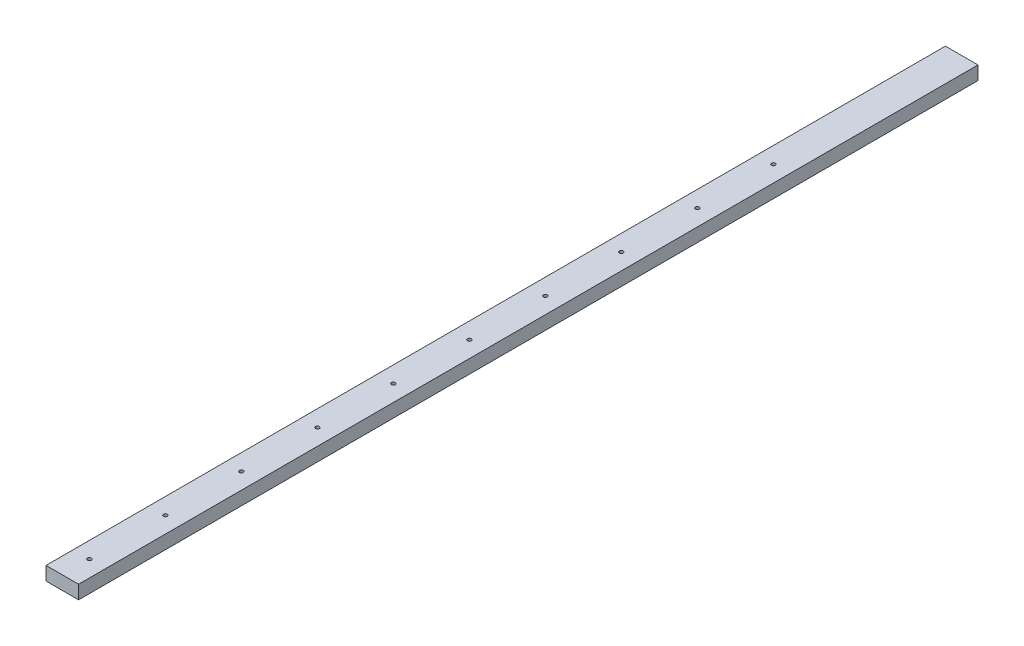
ISO-10303-21;
HEADER;
FILE_DESCRIPTION(('STEP AP214'),'2;1');
FILE_NAME('part.step','',(''),(''),'','','');
FILE_SCHEMA(('AUTOMOTIVE_DESIGN { 1 0 10303 214 1 1 1 1 }'));
ENDSEC;
DATA;
#1=APPLICATION_CONTEXT('core data for automotive mechanical design processes');
#2=APPLICATION_PROTOCOL_DEFINITION('international standard','automotive_design',2000,#1);
#3=PRODUCT_CONTEXT('',#1,'mechanical');
#4=PRODUCT('Part','Part','',(#3));
#5=PRODUCT_RELATED_PRODUCT_CATEGORY('part','',(#4));
#6=PRODUCT_DEFINITION_FORMATION('','',#4);
#7=PRODUCT_DEFINITION_CONTEXT('part definition',#1,'design');
#8=PRODUCT_DEFINITION('design','',#6,#7);
#9=PRODUCT_DEFINITION_SHAPE('','',#8);
#10=(LENGTH_UNIT() NAMED_UNIT(*) SI_UNIT(.MILLI.,.METRE.));
#11=(NAMED_UNIT(*) PLANE_ANGLE_UNIT() SI_UNIT($,.RADIAN.));
#12=(NAMED_UNIT(*) SI_UNIT($,.STERADIAN.) SOLID_ANGLE_UNIT());
#13=UNCERTAINTY_MEASURE_WITH_UNIT(LENGTH_MEASURE(1.E-05),#10,'distance_accuracy_value','');
#14=(GEOMETRIC_REPRESENTATION_CONTEXT(3) GLOBAL_UNCERTAINTY_ASSIGNED_CONTEXT((#13)) GLOBAL_UNIT_ASSIGNED_CONTEXT((#10,
#11,#12)) REPRESENTATION_CONTEXT('',''));
#15=CARTESIAN_POINT('',(0.,0.,0.));
#16=DIRECTION('',(0.,0.,1.));
#17=DIRECTION('',(1.,0.,0.));
#18=AXIS2_PLACEMENT_3D('',#15,#16,#17);
#19=CARTESIAN_POINT('',(30.,-12.5,1657.));
#20=DIRECTION('',(-1.,0.,0.));
#21=DIRECTION('',(0.,0.,1.));
#22=AXIS2_PLACEMENT_3D('',#19,#20,#21);
#23=PLANE('',#22);
#24=DIRECTION('',(0.,1.,0.));
#25=VECTOR('',#24,1.);
#26=CARTESIAN_POINT('',(30.,-12.5,0.));
#27=LINE('',#26,#25);
#28=CARTESIAN_POINT('',(30.,-12.5,0.));
#29=VERTEX_POINT('',#28);
#30=CARTESIAN_POINT('',(30.,12.5,0.));
#31=VERTEX_POINT('',#30);
#32=EDGE_CURVE('E106',#29,#31,#27,.T.);
#33=ORIENTED_EDGE('',*,*,#32,.T.);
#34=DIRECTION('',(0.,0.,-1.));
#35=VECTOR('',#34,1.);
#36=CARTESIAN_POINT('',(30.,12.5,1657.));
#37=LINE('',#36,#35);
#38=CARTESIAN_POINT('',(30.,12.5,1657.));
#39=VERTEX_POINT('',#38);
#40=EDGE_CURVE('E11',#39,#31,#37,.T.);
#41=ORIENTED_EDGE('',*,*,#40,.F.);
#42=DIRECTION('',(0.,1.,0.));
#43=VECTOR('',#42,1.);
#44=CARTESIAN_POINT('',(30.,-12.5,1657.));
#45=LINE('',#44,#43);
#46=CARTESIAN_POINT('',(30.,-12.5,1657.));
#47=VERTEX_POINT('',#46);
#48=EDGE_CURVE('E94',#47,#39,#45,.T.);
#49=ORIENTED_EDGE('',*,*,#48,.F.);
#50=DIRECTION('',(0.,0.,-1.));
#51=VECTOR('',#50,1.);
#52=CARTESIAN_POINT('',(30.,-12.5,1657.));
#53=LINE('',#52,#51);
#54=EDGE_CURVE('E102',#47,#29,#53,.T.);
#55=ORIENTED_EDGE('',*,*,#54,.T.);
#56=EDGE_LOOP('',(#33,#41,#49,#55));
#57=FACE_BOUND('',#56,.T.);
#58=ADVANCED_FACE('F43',(#57),#23,.F.);
#59=CARTESIAN_POINT('',(-30.,12.5,1657.));
#60=DIRECTION('',(0.,-1.,0.));
#61=DIRECTION('',(0.,0.,-1.));
#62=AXIS2_PLACEMENT_3D('',#59,#60,#61);
#63=PLANE('',#62);
#64=CARTESIAN_POINT('',(1.9680074062298E-13,12.5,1607.));
#65=DIRECTION('',(0.,-1.,0.));
#66=DIRECTION('',(0.,0.,-1.));
#67=AXIS2_PLACEMENT_3D('',#64,#65,#66);
#68=CIRCLE('',#67,3.49999999999991);
#69=CARTESIAN_POINT('',(1.9680074062298E-13,12.5,1603.5));
#70=VERTEX_POINT('',#69);
#71=EDGE_CURVE('E123',#70,#70,#68,.T.);
#72=ORIENTED_EDGE('',*,*,#71,.T.);
#73=EDGE_LOOP('',(#72));
#74=FACE_BOUND('',#73,.T.);
#75=CARTESIAN_POINT('',(-2.83434119221028E-13,12.5,1467.));
#76=DIRECTION('',(0.,-1.,0.));
#77=DIRECTION('',(0.,0.,-1.));
#78=AXIS2_PLACEMENT_3D('',#75,#76,#77);
#79=CIRCLE('',#78,3.49999999999989);
#80=CARTESIAN_POINT('',(-2.83434119221028E-13,12.5,1463.5));
#81=VERTEX_POINT('',#80);
#82=EDGE_CURVE('E128',#81,#81,#79,.T.);
#83=ORIENTED_EDGE('',*,*,#82,.T.);
#84=EDGE_LOOP('',(#83));
#85=FACE_BOUND('',#84,.T.);
#86=CARTESIAN_POINT('',(-7.63668979065035E-13,12.5,1327.));
#87=DIRECTION('',(0.,-1.,0.));
#88=DIRECTION('',(0.,0.,-1.));
#89=AXIS2_PLACEMENT_3D('',#86,#87,#88);
#90=CIRCLE('',#89,3.49999999999989);
#91=CARTESIAN_POINT('',(-7.63668979065035E-13,12.5,1323.5));
#92=VERTEX_POINT('',#91);
#93=EDGE_CURVE('E131',#92,#92,#90,.T.);
#94=ORIENTED_EDGE('',*,*,#93,.T.);
#95=EDGE_LOOP('',(#94));
#96=FACE_BOUND('',#95,.T.);
#97=CARTESIAN_POINT('',(-1.24390383890904E-12,12.5,1187.));
#98=DIRECTION('',(0.,-1.,0.));
#99=DIRECTION('',(0.,0.,-1.));
#100=AXIS2_PLACEMENT_3D('',#97,#98,#99);
#101=CIRCLE('',#100,3.49999999999995);
#102=CARTESIAN_POINT('',(-1.24390383890904E-12,12.5,1183.5));
#103=VERTEX_POINT('',#102);
#104=EDGE_CURVE('E134',#103,#103,#101,.T.);
#105=ORIENTED_EDGE('',*,*,#104,.T.);
#106=EDGE_LOOP('',(#105));
#107=FACE_BOUND('',#106,.T.);
#108=CARTESIAN_POINT('',(-1.72413869875305E-12,12.5,1047.));
#109=DIRECTION('',(0.,-1.,0.));
#110=DIRECTION('',(0.,0.,-1.));
#111=AXIS2_PLACEMENT_3D('',#108,#109,#110);
#112=CIRCLE('',#111,3.49999999999995);
#113=CARTESIAN_POINT('',(-1.72413869875305E-12,12.5,1043.5));
#114=VERTEX_POINT('',#113);
#115=EDGE_CURVE('E137',#114,#114,#112,.T.);
#116=ORIENTED_EDGE('',*,*,#115,.T.);
#117=EDGE_LOOP('',(#116));
#118=FACE_BOUND('',#117,.T.);
#119=CARTESIAN_POINT('',(-2.20437355859706E-12,12.5,907.));
#120=DIRECTION('',(0.,-1.,0.));
#121=DIRECTION('',(0.,0.,-1.));
#122=AXIS2_PLACEMENT_3D('',#119,#120,#121);
#123=CIRCLE('',#122,3.49999999999998);
#124=CARTESIAN_POINT('',(-2.20437355859706E-12,12.5,903.5));
#125=VERTEX_POINT('',#124);
#126=EDGE_CURVE('E140',#125,#125,#123,.T.);
#127=ORIENTED_EDGE('',*,*,#126,.T.);
#128=EDGE_LOOP('',(#127));
#129=FACE_BOUND('',#128,.T.);
#130=CARTESIAN_POINT('',(-2.68460841844106E-12,12.5,767.));
#131=DIRECTION('',(0.,-1.,0.));
#132=DIRECTION('',(0.,0.,-1.));
#133=AXIS2_PLACEMENT_3D('',#130,#131,#132);
#134=CIRCLE('',#133,3.49999999999998);
#135=CARTESIAN_POINT('',(-2.68460841844106E-12,12.5,763.5));
#136=VERTEX_POINT('',#135);
#137=EDGE_CURVE('E143',#136,#136,#134,.T.);
#138=ORIENTED_EDGE('',*,*,#137,.T.);
#139=EDGE_LOOP('',(#138));
#140=FACE_BOUND('',#139,.T.);
#141=CARTESIAN_POINT('',(-3.16484327828507E-12,12.5,627.));
#142=DIRECTION('',(0.,-1.,0.));
#143=DIRECTION('',(0.,0.,-1.));
#144=AXIS2_PLACEMENT_3D('',#141,#142,#143);
#145=CIRCLE('',#144,3.49999999999995);
#146=CARTESIAN_POINT('',(-3.16484327828507E-12,12.5,623.5));
#147=VERTEX_POINT('',#146);
#148=EDGE_CURVE('E146',#147,#147,#145,.T.);
#149=ORIENTED_EDGE('',*,*,#148,.T.);
#150=EDGE_LOOP('',(#149));
#151=FACE_BOUND('',#150,.T.);
#152=CARTESIAN_POINT('',(-3.64507813812908E-12,12.5,487.));
#153=DIRECTION('',(0.,-1.,0.));
#154=DIRECTION('',(0.,0.,-1.));
#155=AXIS2_PLACEMENT_3D('',#152,#153,#154);
#156=CIRCLE('',#155,3.49999999999995);
#157=CARTESIAN_POINT('',(-3.64507813812908E-12,12.5,483.5));
#158=VERTEX_POINT('',#157);
#159=EDGE_CURVE('E149',#158,#158,#156,.T.);
#160=ORIENTED_EDGE('',*,*,#159,.T.);
#161=EDGE_LOOP('',(#160));
#162=FACE_BOUND('',#161,.T.);
#163=CARTESIAN_POINT('',(-4.12531299797309E-12,12.5,347.));
#164=DIRECTION('',(0.,-1.,0.));
#165=DIRECTION('',(0.,0.,-1.));
#166=AXIS2_PLACEMENT_3D('',#163,#164,#165);
#167=CIRCLE('',#166,3.49999999999995);
#168=CARTESIAN_POINT('',(-4.12531299797309E-12,12.5,343.5));
#169=VERTEX_POINT('',#168);
#170=EDGE_CURVE('E152',#169,#169,#167,.T.);
#171=ORIENTED_EDGE('',*,*,#170,.T.);
#172=EDGE_LOOP('',(#171));
#173=FACE_BOUND('',#172,.T.);
#174=DIRECTION('',(-1.,0.,0.));
#175=VECTOR('',#174,1.);
#176=CARTESIAN_POINT('',(-30.,12.5,0.));
#177=LINE('',#176,#175);
#178=CARTESIAN_POINT('',(-30.,12.5,0.));
#179=VERTEX_POINT('',#178);
#180=EDGE_CURVE('E98',#31,#179,#177,.T.);
#181=ORIENTED_EDGE('',*,*,#180,.T.);
#182=DIRECTION('',(0.,0.,-1.));
#183=VECTOR('',#182,1.);
#184=CARTESIAN_POINT('',(-30.,12.5,1657.));
#185=LINE('',#184,#183);
#186=CARTESIAN_POINT('',(-30.,12.5,1657.));
#187=VERTEX_POINT('',#186);
#188=EDGE_CURVE('E51',#187,#179,#185,.T.);
#189=ORIENTED_EDGE('',*,*,#188,.F.);
#190=DIRECTION('',(-1.,0.,0.));
#191=VECTOR('',#190,1.);
#192=CARTESIAN_POINT('',(-30.,12.5,1657.));
#193=LINE('',#192,#191);
#194=EDGE_CURVE('E89',#39,#187,#193,.T.);
#195=ORIENTED_EDGE('',*,*,#194,.F.);
#196=ORIENTED_EDGE('',*,*,#40,.T.);
#197=EDGE_LOOP('',(#181,#189,#195,#196));
#198=FACE_BOUND('',#197,.T.);
#199=ADVANCED_FACE('F97',(#74,#85,#96,#107,#118,#129,#140,#151,#162,#173,#198),#63,.F.);
#200=CARTESIAN_POINT('',(-30.,-12.5,1657.));
#201=DIRECTION('',(1.,0.,0.));
#202=DIRECTION('',(0.,0.,-1.));
#203=AXIS2_PLACEMENT_3D('',#200,#201,#202);
#204=PLANE('',#203);
#205=DIRECTION('',(0.,-1.,0.));
#206=VECTOR('',#205,1.);
#207=CARTESIAN_POINT('',(-30.,-12.5,0.));
#208=LINE('',#207,#206);
#209=CARTESIAN_POINT('',(-30.,-12.5,0.));
#210=VERTEX_POINT('',#209);
#211=EDGE_CURVE('E76',#179,#210,#208,.T.);
#212=ORIENTED_EDGE('',*,*,#211,.T.);
#213=DIRECTION('',(0.,0.,-1.));
#214=VECTOR('',#213,1.);
#215=CARTESIAN_POINT('',(-30.,-12.5,1657.));
#216=LINE('',#215,#214);
#217=CARTESIAN_POINT('',(-30.,-12.5,1657.));
#218=VERTEX_POINT('',#217);
#219=EDGE_CURVE('E99',#218,#210,#216,.T.);
#220=ORIENTED_EDGE('',*,*,#219,.F.);
#221=DIRECTION('',(0.,-1.,0.));
#222=VECTOR('',#221,1.);
#223=CARTESIAN_POINT('',(-30.,-12.5,1657.));
#224=LINE('',#223,#222);
#225=EDGE_CURVE('E92',#187,#218,#224,.T.);
#226=ORIENTED_EDGE('',*,*,#225,.F.);
#227=ORIENTED_EDGE('',*,*,#188,.T.);
#228=EDGE_LOOP('',(#212,#220,#226,#227));
#229=FACE_BOUND('',#228,.T.);
#230=ADVANCED_FACE('F100',(#229),#204,.F.);
#231=CARTESIAN_POINT('',(-30.,-12.5,1657.));
#232=DIRECTION('',(0.,1.,0.));
#233=DIRECTION('',(0.,0.,1.));
#234=AXIS2_PLACEMENT_3D('',#231,#232,#233);
#235=PLANE('',#234);
#236=CARTESIAN_POINT('',(1.9680074062298E-13,-12.5,1607.));
#237=DIRECTION('',(0.,1.,0.));
#238=DIRECTION('',(0.,0.,1.));
#239=AXIS2_PLACEMENT_3D('',#236,#237,#238);
#240=CIRCLE('',#239,3.49999999999991);
#241=CARTESIAN_POINT('',(1.9680074062298E-13,-12.5,1610.5));
#242=VERTEX_POINT('',#241);
#243=EDGE_CURVE('E155',#242,#242,#240,.T.);
#244=ORIENTED_EDGE('',*,*,#243,.T.);
#245=EDGE_LOOP('',(#244));
#246=FACE_BOUND('',#245,.T.);
#247=CARTESIAN_POINT('',(-2.83434119221028E-13,-12.5,1467.));
#248=DIRECTION('',(0.,1.,0.));
#249=DIRECTION('',(0.,0.,1.));
#250=AXIS2_PLACEMENT_3D('',#247,#248,#249);
#251=CIRCLE('',#250,3.49999999999989);
#252=CARTESIAN_POINT('',(-2.83434119221028E-13,-12.5,1470.5));
#253=VERTEX_POINT('',#252);
#254=EDGE_CURVE('E180',#253,#253,#251,.T.);
#255=ORIENTED_EDGE('',*,*,#254,.T.);
#256=EDGE_LOOP('',(#255));
#257=FACE_BOUND('',#256,.T.);
#258=CARTESIAN_POINT('',(-7.63668979065035E-13,-12.5,1327.));
#259=DIRECTION('',(0.,1.,0.));
#260=DIRECTION('',(0.,0.,1.));
#261=AXIS2_PLACEMENT_3D('',#258,#259,#260);
#262=CIRCLE('',#261,3.49999999999989);
#263=CARTESIAN_POINT('',(-7.63668979065035E-13,-12.5,1330.5));
#264=VERTEX_POINT('',#263);
#265=EDGE_CURVE('E177',#264,#264,#262,.T.);
#266=ORIENTED_EDGE('',*,*,#265,.T.);
#267=EDGE_LOOP('',(#266));
#268=FACE_BOUND('',#267,.T.);
#269=CARTESIAN_POINT('',(-1.24390383890904E-12,-12.5,1187.));
#270=DIRECTION('',(0.,1.,0.));
#271=DIRECTION('',(0.,0.,1.));
#272=AXIS2_PLACEMENT_3D('',#269,#270,#271);
#273=CIRCLE('',#272,3.49999999999995);
#274=CARTESIAN_POINT('',(-1.24390383890904E-12,-12.5,1190.5));
#275=VERTEX_POINT('',#274);
#276=EDGE_CURVE('E174',#275,#275,#273,.T.);
#277=ORIENTED_EDGE('',*,*,#276,.T.);
#278=EDGE_LOOP('',(#277));
#279=FACE_BOUND('',#278,.T.);
#280=CARTESIAN_POINT('',(-1.72413869875305E-12,-12.5,1047.));
#281=DIRECTION('',(0.,1.,0.));
#282=DIRECTION('',(0.,0.,1.));
#283=AXIS2_PLACEMENT_3D('',#280,#281,#282);
#284=CIRCLE('',#283,3.49999999999995);
#285=CARTESIAN_POINT('',(-1.72413869875305E-12,-12.5,1050.5));
#286=VERTEX_POINT('',#285);
#287=EDGE_CURVE('E171',#286,#286,#284,.T.);
#288=ORIENTED_EDGE('',*,*,#287,.T.);
#289=EDGE_LOOP('',(#288));
#290=FACE_BOUND('',#289,.T.);
#291=CARTESIAN_POINT('',(-2.20437355859706E-12,-12.5,907.));
#292=DIRECTION('',(0.,1.,0.));
#293=DIRECTION('',(0.,0.,1.));
#294=AXIS2_PLACEMENT_3D('',#291,#292,#293);
#295=CIRCLE('',#294,3.49999999999998);
#296=CARTESIAN_POINT('',(-2.20437355859706E-12,-12.5,910.5));
#297=VERTEX_POINT('',#296);
#298=EDGE_CURVE('E168',#297,#297,#295,.T.);
#299=ORIENTED_EDGE('',*,*,#298,.T.);
#300=EDGE_LOOP('',(#299));
#301=FACE_BOUND('',#300,.T.);
#302=CARTESIAN_POINT('',(-2.68460841844106E-12,-12.5,767.));
#303=DIRECTION('',(0.,1.,0.));
#304=DIRECTION('',(0.,0.,1.));
#305=AXIS2_PLACEMENT_3D('',#302,#303,#304);
#306=CIRCLE('',#305,3.49999999999998);
#307=CARTESIAN_POINT('',(-2.68460841844106E-12,-12.5,770.5));
#308=VERTEX_POINT('',#307);
#309=EDGE_CURVE('E165',#308,#308,#306,.T.);
#310=ORIENTED_EDGE('',*,*,#309,.T.);
#311=EDGE_LOOP('',(#310));
#312=FACE_BOUND('',#311,.T.);
#313=CARTESIAN_POINT('',(-3.16484327828507E-12,-12.5,627.));
#314=DIRECTION('',(0.,1.,0.));
#315=DIRECTION('',(0.,0.,1.));
#316=AXIS2_PLACEMENT_3D('',#313,#314,#315);
#317=CIRCLE('',#316,3.49999999999995);
#318=CARTESIAN_POINT('',(-3.16484327828507E-12,-12.5,630.5));
#319=VERTEX_POINT('',#318);
#320=EDGE_CURVE('E162',#319,#319,#317,.T.);
#321=ORIENTED_EDGE('',*,*,#320,.T.);
#322=EDGE_LOOP('',(#321));
#323=FACE_BOUND('',#322,.T.);
#324=CARTESIAN_POINT('',(-3.64507813812908E-12,-12.5,487.));
#325=DIRECTION('',(0.,1.,0.));
#326=DIRECTION('',(0.,0.,1.));
#327=AXIS2_PLACEMENT_3D('',#324,#325,#326);
#328=CIRCLE('',#327,3.49999999999995);
#329=CARTESIAN_POINT('',(-3.64507813812908E-12,-12.5,490.5));
#330=VERTEX_POINT('',#329);
#331=EDGE_CURVE('E159',#330,#330,#328,.T.);
#332=ORIENTED_EDGE('',*,*,#331,.T.);
#333=EDGE_LOOP('',(#332));
#334=FACE_BOUND('',#333,.T.);
#335=CARTESIAN_POINT('',(-4.12531299797309E-12,-12.5,347.));
#336=DIRECTION('',(0.,1.,0.));
#337=DIRECTION('',(0.,0.,1.));
#338=AXIS2_PLACEMENT_3D('',#335,#336,#337);
#339=CIRCLE('',#338,3.49999999999995);
#340=CARTESIAN_POINT('',(-4.12531299797309E-12,-12.5,350.5));
#341=VERTEX_POINT('',#340);
#342=EDGE_CURVE('E156',#341,#341,#339,.T.);
#343=ORIENTED_EDGE('',*,*,#342,.T.);
#344=EDGE_LOOP('',(#343));
#345=FACE_BOUND('',#344,.T.);
#346=CARTESIAN_POINT('',(-5.,-12.5,72.));
#347=DIRECTION('',(0.,-1.,0.));
#348=DIRECTION('',(0.,0.,-1.));
#349=AXIS2_PLACEMENT_3D('',#346,#347,#348);
#350=CIRCLE('',#349,15.);
#351=CARTESIAN_POINT('',(-5.,-12.5,57.));
#352=VERTEX_POINT('',#351);
#353=EDGE_CURVE('E120',#352,#352,#350,.T.);
#354=ORIENTED_EDGE('',*,*,#353,.F.);
#355=EDGE_LOOP('',(#354));
#356=FACE_BOUND('',#355,.T.);
#357=DIRECTION('',(1.,0.,0.));
#358=VECTOR('',#357,1.);
#359=CARTESIAN_POINT('',(-30.,-12.5,0.));
#360=LINE('',#359,#358);
#361=EDGE_CURVE('E82',#210,#29,#360,.T.);
#362=ORIENTED_EDGE('',*,*,#361,.T.);
#363=ORIENTED_EDGE('',*,*,#54,.F.);
#364=DIRECTION('',(1.,0.,0.));
#365=VECTOR('',#364,1.);
#366=CARTESIAN_POINT('',(-30.,-12.5,1657.));
#367=LINE('',#366,#365);
#368=EDGE_CURVE('E59',#218,#47,#367,.T.);
#369=ORIENTED_EDGE('',*,*,#368,.F.);
#370=ORIENTED_EDGE('',*,*,#219,.T.);
#371=EDGE_LOOP('',(#362,#363,#369,#370));
#372=FACE_BOUND('',#371,.T.);
#373=ADVANCED_FACE('F114',(#246,#257,#268,#279,#290,#301,#312,#323,#334,#345,#356,#372),#235,.F.);
#374=CARTESIAN_POINT('',(0.,0.,1657.));
#375=DIRECTION('',(0.,0.,-1.));
#376=DIRECTION('',(-1.,0.,0.));
#377=AXIS2_PLACEMENT_3D('',#374,#375,#376);
#378=PLANE('',#377);
#379=ORIENTED_EDGE('',*,*,#48,.T.);
#380=ORIENTED_EDGE('',*,*,#194,.T.);
#381=ORIENTED_EDGE('',*,*,#225,.T.);
#382=ORIENTED_EDGE('',*,*,#368,.T.);
#383=EDGE_LOOP('',(#379,#380,#381,#382));
#384=FACE_BOUND('',#383,.T.);
#385=ADVANCED_FACE('F90',(#384),#378,.F.);
#386=CARTESIAN_POINT('',(0.,0.,0.));
#387=DIRECTION('',(0.,0.,-1.));
#388=DIRECTION('',(-1.,0.,0.));
#389=AXIS2_PLACEMENT_3D('',#386,#387,#388);
#390=PLANE('',#389);
#391=ORIENTED_EDGE('',*,*,#32,.F.);
#392=ORIENTED_EDGE('',*,*,#361,.F.);
#393=ORIENTED_EDGE('',*,*,#211,.F.);
#394=ORIENTED_EDGE('',*,*,#180,.F.);
#395=EDGE_LOOP('',(#391,#392,#393,#394));
#396=FACE_BOUND('',#395,.T.);
#397=ADVANCED_FACE('F117',(#396),#390,.T.);
#398=CARTESIAN_POINT('',(-5.,-2.5,72.));
#399=DIRECTION('',(0.,-1.,0.));
#400=DIRECTION('',(0.,0.,-1.));
#401=AXIS2_PLACEMENT_3D('',#398,#399,#400);
#402=CYLINDRICAL_SURFACE('',#401,15.);
#403=CARTESIAN_POINT('',(-5.,-2.5,72.));
#404=DIRECTION('',(0.,-1.,0.));
#405=DIRECTION('',(0.,0.,-1.));
#406=AXIS2_PLACEMENT_3D('',#403,#404,#405);
#407=CIRCLE('',#406,15.);
#408=CARTESIAN_POINT('',(-5.,-2.5,57.));
#409=VERTEX_POINT('',#408);
#410=EDGE_CURVE('E109',#409,#409,#407,.T.);
#411=ORIENTED_EDGE('',*,*,#410,.F.);
#412=EDGE_LOOP('',(#411));
#413=FACE_BOUND('',#412,.T.);
#414=ORIENTED_EDGE('',*,*,#353,.T.);
#415=EDGE_LOOP('',(#414));
#416=FACE_BOUND('',#415,.T.);
#417=ADVANCED_FACE('F229',(#413,#416),#402,.F.);
#418=CARTESIAN_POINT('',(-5.,-2.5,72.));
#419=DIRECTION('',(0.,-1.,0.));
#420=DIRECTION('',(0.,0.,-1.));
#421=AXIS2_PLACEMENT_3D('',#418,#419,#420);
#422=PLANE('',#421);
#423=ORIENTED_EDGE('',*,*,#410,.T.);
#424=EDGE_LOOP('',(#423));
#425=FACE_BOUND('',#424,.T.);
#426=ADVANCED_FACE('F218',(#425),#422,.T.);
#427=CARTESIAN_POINT('',(-4.12531299797309E-12,-12.5,347.));
#428=DIRECTION('',(0.,1.,0.));
#429=DIRECTION('',(0.,0.,1.));
#430=AXIS2_PLACEMENT_3D('',#427,#428,#429);
#431=CYLINDRICAL_SURFACE('',#430,3.49999999999995);
#432=ORIENTED_EDGE('',*,*,#342,.F.);
#433=EDGE_LOOP('',(#432));
#434=FACE_BOUND('',#433,.T.);
#435=ORIENTED_EDGE('',*,*,#170,.F.);
#436=EDGE_LOOP('',(#435));
#437=FACE_BOUND('',#436,.T.);
#438=ADVANCED_FACE('F215',(#434,#437),#431,.F.);
#439=CARTESIAN_POINT('',(-3.64507813812908E-12,-12.5,487.));
#440=DIRECTION('',(0.,1.,0.));
#441=DIRECTION('',(0.,0.,1.));
#442=AXIS2_PLACEMENT_3D('',#439,#440,#441);
#443=CYLINDRICAL_SURFACE('',#442,3.49999999999995);
#444=ORIENTED_EDGE('',*,*,#331,.F.);
#445=EDGE_LOOP('',(#444));
#446=FACE_BOUND('',#445,.T.);
#447=ORIENTED_EDGE('',*,*,#159,.F.);
#448=EDGE_LOOP('',(#447));
#449=FACE_BOUND('',#448,.T.);
#450=ADVANCED_FACE('F217',(#446,#449),#443,.F.);
#451=CARTESIAN_POINT('',(-3.16484327828507E-12,-12.5,627.));
#452=DIRECTION('',(0.,1.,0.));
#453=DIRECTION('',(0.,0.,1.));
#454=AXIS2_PLACEMENT_3D('',#451,#452,#453);
#455=CYLINDRICAL_SURFACE('',#454,3.49999999999995);
#456=ORIENTED_EDGE('',*,*,#320,.F.);
#457=EDGE_LOOP('',(#456));
#458=FACE_BOUND('',#457,.T.);
#459=ORIENTED_EDGE('',*,*,#148,.F.);
#460=EDGE_LOOP('',(#459));
#461=FACE_BOUND('',#460,.T.);
#462=ADVANCED_FACE('F225',(#458,#461),#455,.F.);
#463=CARTESIAN_POINT('',(-2.68460841844106E-12,-12.5,767.));
#464=DIRECTION('',(0.,1.,0.));
#465=DIRECTION('',(0.,0.,1.));
#466=AXIS2_PLACEMENT_3D('',#463,#464,#465);
#467=CYLINDRICAL_SURFACE('',#466,3.49999999999998);
#468=ORIENTED_EDGE('',*,*,#309,.F.);
#469=EDGE_LOOP('',(#468));
#470=FACE_BOUND('',#469,.T.);
#471=ORIENTED_EDGE('',*,*,#137,.F.);
#472=EDGE_LOOP('',(#471));
#473=FACE_BOUND('',#472,.T.);
#474=ADVANCED_FACE('F304',(#470,#473),#467,.F.);
#475=CARTESIAN_POINT('',(-2.20437355859706E-12,-12.5,907.));
#476=DIRECTION('',(0.,1.,0.));
#477=DIRECTION('',(0.,0.,1.));
#478=AXIS2_PLACEMENT_3D('',#475,#476,#477);
#479=CYLINDRICAL_SURFACE('',#478,3.49999999999998);
#480=ORIENTED_EDGE('',*,*,#298,.F.);
#481=EDGE_LOOP('',(#480));
#482=FACE_BOUND('',#481,.T.);
#483=ORIENTED_EDGE('',*,*,#126,.F.);
#484=EDGE_LOOP('',(#483));
#485=FACE_BOUND('',#484,.T.);
#486=ADVANCED_FACE('F313',(#482,#485),#479,.F.);
#487=CARTESIAN_POINT('',(-1.72413869875305E-12,-12.5,1047.));
#488=DIRECTION('',(0.,1.,0.));
#489=DIRECTION('',(0.,0.,1.));
#490=AXIS2_PLACEMENT_3D('',#487,#488,#489);
#491=CYLINDRICAL_SURFACE('',#490,3.49999999999995);
#492=ORIENTED_EDGE('',*,*,#287,.F.);
#493=EDGE_LOOP('',(#492));
#494=FACE_BOUND('',#493,.T.);
#495=ORIENTED_EDGE('',*,*,#115,.F.);
#496=EDGE_LOOP('',(#495));
#497=FACE_BOUND('',#496,.T.);
#498=ADVANCED_FACE('F322',(#494,#497),#491,.F.);
#499=CARTESIAN_POINT('',(-1.24390383890904E-12,-12.5,1187.));
#500=DIRECTION('',(0.,1.,0.));
#501=DIRECTION('',(0.,0.,1.));
#502=AXIS2_PLACEMENT_3D('',#499,#500,#501);
#503=CYLINDRICAL_SURFACE('',#502,3.49999999999995);
#504=ORIENTED_EDGE('',*,*,#276,.F.);
#505=EDGE_LOOP('',(#504));
#506=FACE_BOUND('',#505,.T.);
#507=ORIENTED_EDGE('',*,*,#104,.F.);
#508=EDGE_LOOP('',(#507));
#509=FACE_BOUND('',#508,.T.);
#510=ADVANCED_FACE('F331',(#506,#509),#503,.F.);
#511=CARTESIAN_POINT('',(-7.63668979065035E-13,-12.5,1327.));
#512=DIRECTION('',(0.,1.,0.));
#513=DIRECTION('',(0.,0.,1.));
#514=AXIS2_PLACEMENT_3D('',#511,#512,#513);
#515=CYLINDRICAL_SURFACE('',#514,3.49999999999989);
#516=ORIENTED_EDGE('',*,*,#265,.F.);
#517=EDGE_LOOP('',(#516));
#518=FACE_BOUND('',#517,.T.);
#519=ORIENTED_EDGE('',*,*,#93,.F.);
#520=EDGE_LOOP('',(#519));
#521=FACE_BOUND('',#520,.T.);
#522=ADVANCED_FACE('F340',(#518,#521),#515,.F.);
#523=CARTESIAN_POINT('',(-2.83434119221028E-13,-12.5,1467.));
#524=DIRECTION('',(0.,1.,0.));
#525=DIRECTION('',(0.,0.,1.));
#526=AXIS2_PLACEMENT_3D('',#523,#524,#525);
#527=CYLINDRICAL_SURFACE('',#526,3.49999999999989);
#528=ORIENTED_EDGE('',*,*,#254,.F.);
#529=EDGE_LOOP('',(#528));
#530=FACE_BOUND('',#529,.T.);
#531=ORIENTED_EDGE('',*,*,#82,.F.);
#532=EDGE_LOOP('',(#531));
#533=FACE_BOUND('',#532,.T.);
#534=ADVANCED_FACE('F191',(#530,#533),#527,.F.);
#535=CARTESIAN_POINT('',(1.9680074062298E-13,-12.5,1607.));
#536=DIRECTION('',(0.,1.,0.));
#537=DIRECTION('',(0.,0.,1.));
#538=AXIS2_PLACEMENT_3D('',#535,#536,#537);
#539=CYLINDRICAL_SURFACE('',#538,3.49999999999991);
#540=ORIENTED_EDGE('',*,*,#243,.F.);
#541=EDGE_LOOP('',(#540));
#542=FACE_BOUND('',#541,.T.);
#543=ORIENTED_EDGE('',*,*,#71,.F.);
#544=EDGE_LOOP('',(#543));
#545=FACE_BOUND('',#544,.T.);
#546=ADVANCED_FACE('F188',(#542,#545),#539,.F.);
#547=CLOSED_SHELL('',(#58,#199,#230,#373,#385,#397,#417,#426,#438,#450,#462,#474,#486,#498,#510,
#522,#534,#546));
#548=MANIFOLD_SOLID_BREP('B2',#547);
#549=ADVANCED_BREP_SHAPE_REPRESENTATION('',(#18,#548),#14);
#550=SHAPE_DEFINITION_REPRESENTATION(#9,#549);
ENDSEC;
END-ISO-10303-21;
